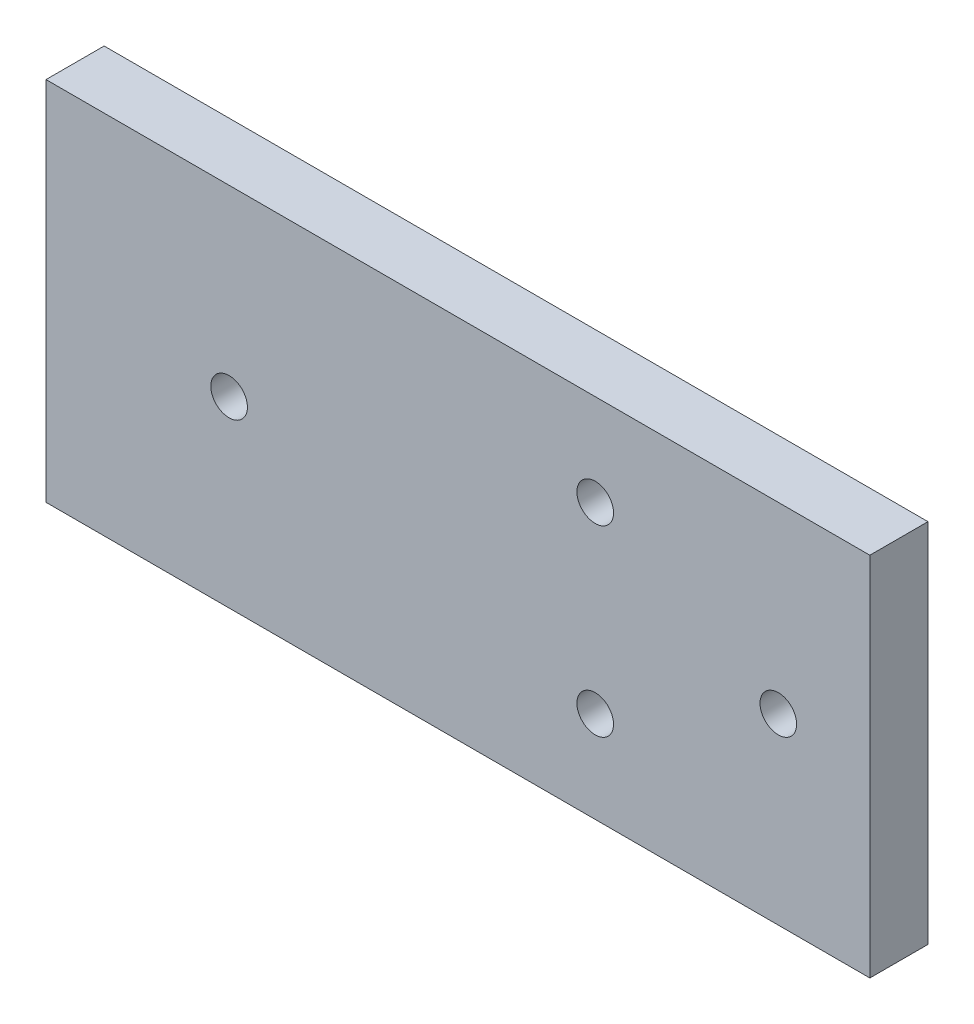
ISO-10303-21;
HEADER;
FILE_DESCRIPTION(('STEP AP214'),'2;1');
FILE_NAME('part.step','',(''),(''),'','','');
FILE_SCHEMA(('AUTOMOTIVE_DESIGN { 1 0 10303 214 1 1 1 1 }'));
ENDSEC;
DATA;
#1=APPLICATION_CONTEXT('core data for automotive mechanical design processes');
#2=APPLICATION_PROTOCOL_DEFINITION('international standard','automotive_design',2000,#1);
#3=PRODUCT_CONTEXT('',#1,'mechanical');
#4=PRODUCT('Part','Part','',(#3));
#5=PRODUCT_RELATED_PRODUCT_CATEGORY('part','',(#4));
#6=PRODUCT_DEFINITION_FORMATION('','',#4);
#7=PRODUCT_DEFINITION_CONTEXT('part definition',#1,'design');
#8=PRODUCT_DEFINITION('design','',#6,#7);
#9=PRODUCT_DEFINITION_SHAPE('','',#8);
#10=(LENGTH_UNIT() NAMED_UNIT(*) SI_UNIT(.MILLI.,.METRE.));
#11=(NAMED_UNIT(*) PLANE_ANGLE_UNIT() SI_UNIT($,.RADIAN.));
#12=(NAMED_UNIT(*) SI_UNIT($,.STERADIAN.) SOLID_ANGLE_UNIT());
#13=UNCERTAINTY_MEASURE_WITH_UNIT(LENGTH_MEASURE(1.E-05),#10,'distance_accuracy_value','');
#14=(GEOMETRIC_REPRESENTATION_CONTEXT(3) GLOBAL_UNCERTAINTY_ASSIGNED_CONTEXT((#13)) GLOBAL_UNIT_ASSIGNED_CONTEXT((#10,
#11,#12)) REPRESENTATION_CONTEXT('',''));
#15=CARTESIAN_POINT('',(0.,0.,0.));
#16=DIRECTION('',(0.,0.,1.));
#17=DIRECTION('',(1.,0.,0.));
#18=AXIS2_PLACEMENT_3D('',#15,#16,#17);
#19=CARTESIAN_POINT('',(0.,0.,6.35));
#20=DIRECTION('',(0.,0.,-1.));
#21=DIRECTION('',(-1.,0.,0.));
#22=AXIS2_PLACEMENT_3D('',#19,#20,#21);
#23=PLANE('',#22);
#24=DIRECTION('',(0.,-1.,0.));
#25=VECTOR('',#24,1.);
#26=CARTESIAN_POINT('',(0.,0.,6.35));
#27=LINE('',#26,#25);
#28=CARTESIAN_POINT('',(0.,40.,6.35));
#29=VERTEX_POINT('',#28);
#30=CARTESIAN_POINT('',(0.,0.,6.35));
#31=VERTEX_POINT('',#30);
#32=EDGE_CURVE('E92',#29,#31,#27,.T.);
#33=ORIENTED_EDGE('',*,*,#32,.T.);
#34=DIRECTION('',(1.,0.,0.));
#35=VECTOR('',#34,1.);
#36=CARTESIAN_POINT('',(0.,0.,6.35));
#37=LINE('',#36,#35);
#38=CARTESIAN_POINT('',(90.,0.,6.35));
#39=VERTEX_POINT('',#38);
#40=EDGE_CURVE('E87',#31,#39,#37,.T.);
#41=ORIENTED_EDGE('',*,*,#40,.T.);
#42=DIRECTION('',(0.,1.,0.));
#43=VECTOR('',#42,1.);
#44=CARTESIAN_POINT('',(90.,0.,6.35));
#45=LINE('',#44,#43);
#46=CARTESIAN_POINT('',(90.,40.,6.35));
#47=VERTEX_POINT('',#46);
#48=EDGE_CURVE('E90',#39,#47,#45,.T.);
#49=ORIENTED_EDGE('',*,*,#48,.T.);
#50=DIRECTION('',(-1.,0.,0.));
#51=VECTOR('',#50,1.);
#52=CARTESIAN_POINT('',(0.,40.,6.35));
#53=LINE('',#52,#51);
#54=EDGE_CURVE('E57',#47,#29,#53,.T.);
#55=ORIENTED_EDGE('',*,*,#54,.T.);
#56=EDGE_LOOP('',(#33,#41,#49,#55));
#57=FACE_BOUND('',#56,.T.);
#58=CARTESIAN_POINT('',(60.,30.,6.35));
#59=DIRECTION('',(0.,0.,1.));
#60=DIRECTION('',(1.,0.,0.));
#61=AXIS2_PLACEMENT_3D('',#58,#59,#60);
#62=CIRCLE('',#61,2.);
#63=CARTESIAN_POINT('',(62.,30.,6.35));
#64=VERTEX_POINT('',#63);
#65=EDGE_CURVE('E112',#64,#64,#62,.T.);
#66=ORIENTED_EDGE('',*,*,#65,.F.);
#67=EDGE_LOOP('',(#66));
#68=FACE_BOUND('',#67,.T.);
#69=CARTESIAN_POINT('',(60.,10.,6.35));
#70=DIRECTION('',(0.,0.,1.));
#71=DIRECTION('',(1.,0.,0.));
#72=AXIS2_PLACEMENT_3D('',#69,#70,#71);
#73=CIRCLE('',#72,2.);
#74=CARTESIAN_POINT('',(62.,10.,6.35));
#75=VERTEX_POINT('',#74);
#76=EDGE_CURVE('E134',#75,#75,#73,.T.);
#77=ORIENTED_EDGE('',*,*,#76,.F.);
#78=EDGE_LOOP('',(#77));
#79=FACE_BOUND('',#78,.T.);
#80=CARTESIAN_POINT('',(20.,20.,6.35));
#81=DIRECTION('',(0.,0.,1.));
#82=DIRECTION('',(1.,0.,0.));
#83=AXIS2_PLACEMENT_3D('',#80,#81,#82);
#84=CIRCLE('',#83,2.);
#85=CARTESIAN_POINT('',(22.,20.,6.35));
#86=VERTEX_POINT('',#85);
#87=EDGE_CURVE('E142',#86,#86,#84,.T.);
#88=ORIENTED_EDGE('',*,*,#87,.F.);
#89=EDGE_LOOP('',(#88));
#90=FACE_BOUND('',#89,.T.);
#91=CARTESIAN_POINT('',(80.,20.,6.35));
#92=DIRECTION('',(0.,0.,1.));
#93=DIRECTION('',(1.,0.,0.));
#94=AXIS2_PLACEMENT_3D('',#91,#92,#93);
#95=CIRCLE('',#94,2.);
#96=CARTESIAN_POINT('',(82.,20.,6.35));
#97=VERTEX_POINT('',#96);
#98=EDGE_CURVE('E150',#97,#97,#95,.T.);
#99=ORIENTED_EDGE('',*,*,#98,.F.);
#100=EDGE_LOOP('',(#99));
#101=FACE_BOUND('',#100,.T.);
#102=ADVANCED_FACE('F39',(#57,#68,#79,#90,#101),#23,.F.);
#103=CARTESIAN_POINT('',(0.,0.,0.));
#104=DIRECTION('',(0.,0.,-1.));
#105=DIRECTION('',(-1.,0.,0.));
#106=AXIS2_PLACEMENT_3D('',#103,#104,#105);
#107=PLANE('',#106);
#108=CARTESIAN_POINT('',(20.,20.,0.));
#109=DIRECTION('',(0.,0.,1.));
#110=DIRECTION('',(1.,0.,0.));
#111=AXIS2_PLACEMENT_3D('',#108,#109,#110);
#112=CIRCLE('',#111,2.);
#113=CARTESIAN_POINT('',(22.,20.,0.));
#114=VERTEX_POINT('',#113);
#115=EDGE_CURVE('E146',#114,#114,#112,.T.);
#116=ORIENTED_EDGE('',*,*,#115,.T.);
#117=EDGE_LOOP('',(#116));
#118=FACE_BOUND('',#117,.T.);
#119=CARTESIAN_POINT('',(60.,30.,0.));
#120=DIRECTION('',(0.,0.,1.));
#121=DIRECTION('',(1.,0.,0.));
#122=AXIS2_PLACEMENT_3D('',#119,#120,#121);
#123=CIRCLE('',#122,2.);
#124=CARTESIAN_POINT('',(62.,30.,0.));
#125=VERTEX_POINT('',#124);
#126=EDGE_CURVE('E130',#125,#125,#123,.T.);
#127=ORIENTED_EDGE('',*,*,#126,.T.);
#128=EDGE_LOOP('',(#127));
#129=FACE_BOUND('',#128,.T.);
#130=DIRECTION('',(0.,-1.,0.));
#131=VECTOR('',#130,1.);
#132=CARTESIAN_POINT('',(0.,0.,0.));
#133=LINE('',#132,#131);
#134=CARTESIAN_POINT('',(0.,40.,0.));
#135=VERTEX_POINT('',#134);
#136=CARTESIAN_POINT('',(0.,0.,0.));
#137=VERTEX_POINT('',#136);
#138=EDGE_CURVE('E108',#135,#137,#133,.T.);
#139=ORIENTED_EDGE('',*,*,#138,.F.);
#140=DIRECTION('',(-1.,0.,0.));
#141=VECTOR('',#140,1.);
#142=CARTESIAN_POINT('',(0.,40.,0.));
#143=LINE('',#142,#141);
#144=CARTESIAN_POINT('',(90.,40.,0.));
#145=VERTEX_POINT('',#144);
#146=EDGE_CURVE('E80',#145,#135,#143,.T.);
#147=ORIENTED_EDGE('',*,*,#146,.F.);
#148=DIRECTION('',(0.,1.,0.));
#149=VECTOR('',#148,1.);
#150=CARTESIAN_POINT('',(90.,0.,0.));
#151=LINE('',#150,#149);
#152=CARTESIAN_POINT('',(90.,0.,0.));
#153=VERTEX_POINT('',#152);
#154=EDGE_CURVE('E74',#153,#145,#151,.T.);
#155=ORIENTED_EDGE('',*,*,#154,.F.);
#156=DIRECTION('',(1.,0.,0.));
#157=VECTOR('',#156,1.);
#158=CARTESIAN_POINT('',(0.,0.,0.));
#159=LINE('',#158,#157);
#160=EDGE_CURVE('E97',#137,#153,#159,.T.);
#161=ORIENTED_EDGE('',*,*,#160,.F.);
#162=EDGE_LOOP('',(#139,#147,#155,#161));
#163=FACE_BOUND('',#162,.T.);
#164=CARTESIAN_POINT('',(60.,10.,0.));
#165=DIRECTION('',(0.,0.,1.));
#166=DIRECTION('',(1.,0.,0.));
#167=AXIS2_PLACEMENT_3D('',#164,#165,#166);
#168=CIRCLE('',#167,2.);
#169=CARTESIAN_POINT('',(62.,10.,0.));
#170=VERTEX_POINT('',#169);
#171=EDGE_CURVE('E138',#170,#170,#168,.T.);
#172=ORIENTED_EDGE('',*,*,#171,.T.);
#173=EDGE_LOOP('',(#172));
#174=FACE_BOUND('',#173,.T.);
#175=CARTESIAN_POINT('',(80.,20.,0.));
#176=DIRECTION('',(0.,0.,1.));
#177=DIRECTION('',(1.,0.,0.));
#178=AXIS2_PLACEMENT_3D('',#175,#176,#177);
#179=CIRCLE('',#178,2.);
#180=CARTESIAN_POINT('',(82.,20.,0.));
#181=VERTEX_POINT('',#180);
#182=EDGE_CURVE('E154',#181,#181,#179,.T.);
#183=ORIENTED_EDGE('',*,*,#182,.T.);
#184=EDGE_LOOP('',(#183));
#185=FACE_BOUND('',#184,.T.);
#186=ADVANCED_FACE('F125',(#118,#129,#163,#174,#185),#107,.T.);
#187=CARTESIAN_POINT('',(0.,0.,6.35));
#188=DIRECTION('',(1.,0.,0.));
#189=DIRECTION('',(0.,0.,-1.));
#190=AXIS2_PLACEMENT_3D('',#187,#188,#189);
#191=PLANE('',#190);
#192=ORIENTED_EDGE('',*,*,#138,.T.);
#193=DIRECTION('',(0.,0.,-1.));
#194=VECTOR('',#193,1.);
#195=CARTESIAN_POINT('',(0.,0.,6.35));
#196=LINE('',#195,#194);
#197=EDGE_CURVE('E11',#31,#137,#196,.T.);
#198=ORIENTED_EDGE('',*,*,#197,.F.);
#199=ORIENTED_EDGE('',*,*,#32,.F.);
#200=DIRECTION('',(0.,0.,-1.));
#201=VECTOR('',#200,1.);
#202=CARTESIAN_POINT('',(0.,40.,6.35));
#203=LINE('',#202,#201);
#204=EDGE_CURVE('E104',#29,#135,#203,.T.);
#205=ORIENTED_EDGE('',*,*,#204,.T.);
#206=EDGE_LOOP('',(#192,#198,#199,#205));
#207=FACE_BOUND('',#206,.T.);
#208=ADVANCED_FACE('F41',(#207),#191,.F.);
#209=CARTESIAN_POINT('',(0.,0.,6.35));
#210=DIRECTION('',(0.,1.,0.));
#211=DIRECTION('',(0.,0.,1.));
#212=AXIS2_PLACEMENT_3D('',#209,#210,#211);
#213=PLANE('',#212);
#214=ORIENTED_EDGE('',*,*,#160,.T.);
#215=DIRECTION('',(0.,0.,-1.));
#216=VECTOR('',#215,1.);
#217=CARTESIAN_POINT('',(90.,0.,6.35));
#218=LINE('',#217,#216);
#219=EDGE_CURVE('E49',#39,#153,#218,.T.);
#220=ORIENTED_EDGE('',*,*,#219,.F.);
#221=ORIENTED_EDGE('',*,*,#40,.F.);
#222=ORIENTED_EDGE('',*,*,#197,.T.);
#223=EDGE_LOOP('',(#214,#220,#221,#222));
#224=FACE_BOUND('',#223,.T.);
#225=ADVANCED_FACE('F96',(#224),#213,.F.);
#226=CARTESIAN_POINT('',(90.,0.,6.35));
#227=DIRECTION('',(-1.,0.,0.));
#228=DIRECTION('',(0.,0.,1.));
#229=AXIS2_PLACEMENT_3D('',#226,#227,#228);
#230=PLANE('',#229);
#231=ORIENTED_EDGE('',*,*,#154,.T.);
#232=DIRECTION('',(0.,0.,-1.));
#233=VECTOR('',#232,1.);
#234=CARTESIAN_POINT('',(90.,40.,6.35));
#235=LINE('',#234,#233);
#236=EDGE_CURVE('E99',#47,#145,#235,.T.);
#237=ORIENTED_EDGE('',*,*,#236,.F.);
#238=ORIENTED_EDGE('',*,*,#48,.F.);
#239=ORIENTED_EDGE('',*,*,#219,.T.);
#240=EDGE_LOOP('',(#231,#237,#238,#239));
#241=FACE_BOUND('',#240,.T.);
#242=ADVANCED_FACE('F100',(#241),#230,.F.);
#243=CARTESIAN_POINT('',(0.,40.,6.35));
#244=DIRECTION('',(0.,-1.,0.));
#245=DIRECTION('',(1.,0.,0.));
#246=AXIS2_PLACEMENT_3D('',#243,#244,#245);
#247=PLANE('',#246);
#248=ORIENTED_EDGE('',*,*,#146,.T.);
#249=ORIENTED_EDGE('',*,*,#204,.F.);
#250=ORIENTED_EDGE('',*,*,#54,.F.);
#251=ORIENTED_EDGE('',*,*,#236,.T.);
#252=EDGE_LOOP('',(#248,#249,#250,#251));
#253=FACE_BOUND('',#252,.T.);
#254=ADVANCED_FACE('F122',(#253),#247,.F.);
#255=CARTESIAN_POINT('',(60.,30.,6.35));
#256=DIRECTION('',(0.,0.,-1.));
#257=DIRECTION('',(-1.,0.,0.));
#258=AXIS2_PLACEMENT_3D('',#255,#256,#257);
#259=CYLINDRICAL_SURFACE('',#258,2.);
#260=ORIENTED_EDGE('',*,*,#65,.T.);
#261=EDGE_LOOP('',(#260));
#262=FACE_BOUND('',#261,.T.);
#263=ORIENTED_EDGE('',*,*,#126,.F.);
#264=EDGE_LOOP('',(#263));
#265=FACE_BOUND('',#264,.T.);
#266=ADVANCED_FACE('F173',(#262,#265),#259,.F.);
#267=CARTESIAN_POINT('',(60.,10.,6.35));
#268=DIRECTION('',(0.,0.,-1.));
#269=DIRECTION('',(-1.,0.,0.));
#270=AXIS2_PLACEMENT_3D('',#267,#268,#269);
#271=CYLINDRICAL_SURFACE('',#270,2.);
#272=ORIENTED_EDGE('',*,*,#76,.T.);
#273=EDGE_LOOP('',(#272));
#274=FACE_BOUND('',#273,.T.);
#275=ORIENTED_EDGE('',*,*,#171,.F.);
#276=EDGE_LOOP('',(#275));
#277=FACE_BOUND('',#276,.T.);
#278=ADVANCED_FACE('F219',(#274,#277),#271,.F.);
#279=CARTESIAN_POINT('',(20.,20.,6.35));
#280=DIRECTION('',(0.,0.,-1.));
#281=DIRECTION('',(-1.,0.,0.));
#282=AXIS2_PLACEMENT_3D('',#279,#280,#281);
#283=CYLINDRICAL_SURFACE('',#282,2.);
#284=ORIENTED_EDGE('',*,*,#87,.T.);
#285=EDGE_LOOP('',(#284));
#286=FACE_BOUND('',#285,.T.);
#287=ORIENTED_EDGE('',*,*,#115,.F.);
#288=EDGE_LOOP('',(#287));
#289=FACE_BOUND('',#288,.T.);
#290=ADVANCED_FACE('F227',(#286,#289),#283,.F.);
#291=CARTESIAN_POINT('',(80.,20.,6.35));
#292=DIRECTION('',(0.,0.,-1.));
#293=DIRECTION('',(-1.,0.,0.));
#294=AXIS2_PLACEMENT_3D('',#291,#292,#293);
#295=CYLINDRICAL_SURFACE('',#294,2.);
#296=ORIENTED_EDGE('',*,*,#98,.T.);
#297=EDGE_LOOP('',(#296));
#298=FACE_BOUND('',#297,.T.);
#299=ORIENTED_EDGE('',*,*,#182,.F.);
#300=EDGE_LOOP('',(#299));
#301=FACE_BOUND('',#300,.T.);
#302=ADVANCED_FACE('F162',(#298,#301),#295,.F.);
#303=CLOSED_SHELL('',(#102,#186,#208,#225,#242,#254,#266,#278,#290,#302));
#304=MANIFOLD_SOLID_BREP('B2',#303);
#305=ADVANCED_BREP_SHAPE_REPRESENTATION('',(#18,#304),#14);
#306=SHAPE_DEFINITION_REPRESENTATION(#9,#305);
ENDSEC;
END-ISO-10303-21;
